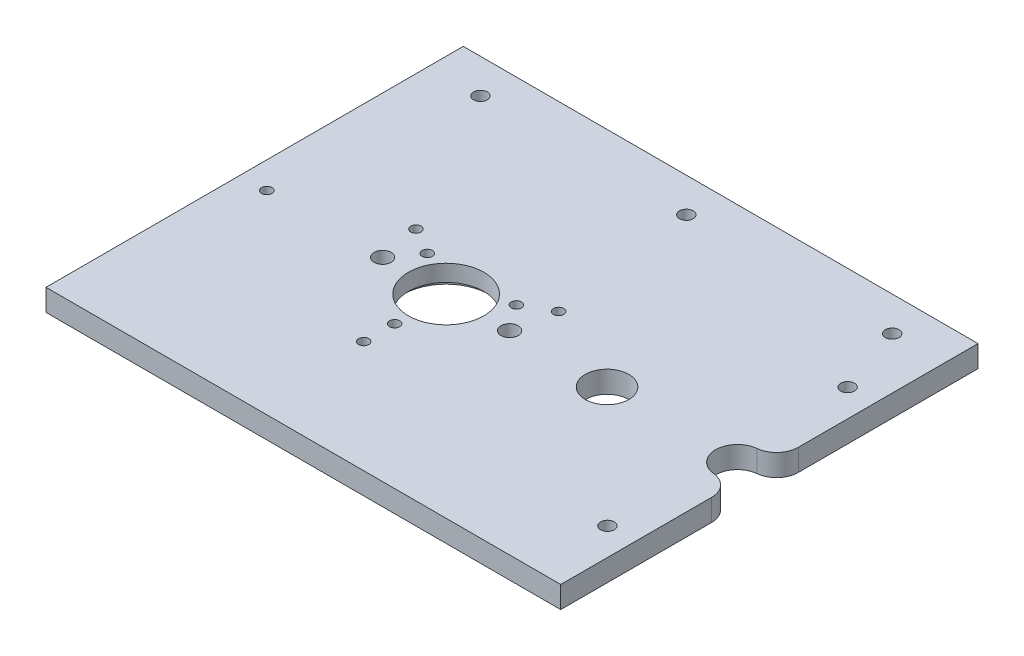
ISO-10303-21;
HEADER;
FILE_DESCRIPTION(('STEP AP214'),'2;1');
FILE_NAME('part.step','',(''),(''),'','','');
FILE_SCHEMA(('AUTOMOTIVE_DESIGN { 1 0 10303 214 1 1 1 1 }'));
ENDSEC;
DATA;
#1=APPLICATION_CONTEXT('core data for automotive mechanical design processes');
#2=APPLICATION_PROTOCOL_DEFINITION('international standard','automotive_design',2000,#1);
#3=PRODUCT_CONTEXT('',#1,'mechanical');
#4=PRODUCT('Part','Part','',(#3));
#5=PRODUCT_RELATED_PRODUCT_CATEGORY('part','',(#4));
#6=PRODUCT_DEFINITION_FORMATION('','',#4);
#7=PRODUCT_DEFINITION_CONTEXT('part definition',#1,'design');
#8=PRODUCT_DEFINITION('design','',#6,#7);
#9=PRODUCT_DEFINITION_SHAPE('','',#8);
#10=(LENGTH_UNIT() NAMED_UNIT(*) SI_UNIT(.MILLI.,.METRE.));
#11=(NAMED_UNIT(*) PLANE_ANGLE_UNIT() SI_UNIT($,.RADIAN.));
#12=(NAMED_UNIT(*) SI_UNIT($,.STERADIAN.) SOLID_ANGLE_UNIT());
#13=UNCERTAINTY_MEASURE_WITH_UNIT(LENGTH_MEASURE(1.E-05),#10,'distance_accuracy_value','');
#14=(GEOMETRIC_REPRESENTATION_CONTEXT(3) GLOBAL_UNCERTAINTY_ASSIGNED_CONTEXT((#13)) GLOBAL_UNIT_ASSIGNED_CONTEXT((#10,
#11,#12)) REPRESENTATION_CONTEXT('',''));
#15=CARTESIAN_POINT('',(0.,0.,0.));
#16=DIRECTION('',(0.,0.,1.));
#17=DIRECTION('',(1.,0.,0.));
#18=AXIS2_PLACEMENT_3D('',#15,#16,#17);
#19=CARTESIAN_POINT('',(75.,3.175,-50.8));
#20=DIRECTION('',(-1.,0.,0.));
#21=DIRECTION('',(0.,0.,1.));
#22=AXIS2_PLACEMENT_3D('',#19,#20,#21);
#23=PLANE('',#22);
#24=DIRECTION('',(0.,0.,-1.));
#25=VECTOR('',#24,1.);
#26=CARTESIAN_POINT('',(75.,-3.175,-50.8));
#27=LINE('',#26,#25);
#28=CARTESIAN_POINT('',(75.,-3.175,50.8));
#29=VERTEX_POINT('',#28);
#30=CARTESIAN_POINT('',(75.,-3.175,6.83833454217762));
#31=VERTEX_POINT('',#30);
#32=EDGE_CURVE('E119',#29,#31,#27,.T.);
#33=ORIENTED_EDGE('',*,*,#32,.T.);
#34=DIRECTION('',(0.,1.,0.));
#35=VECTOR('',#34,1.);
#36=CARTESIAN_POINT('',(75.,3.175,6.83833454217762));
#37=LINE('',#36,#35);
#38=CARTESIAN_POINT('',(75.,3.175,6.83833454217762));
#39=VERTEX_POINT('',#38);
#40=EDGE_CURVE('E255',#31,#39,#37,.T.);
#41=ORIENTED_EDGE('',*,*,#40,.T.);
#42=DIRECTION('',(0.,0.,-1.));
#43=VECTOR('',#42,1.);
#44=CARTESIAN_POINT('',(75.,3.175,-50.8));
#45=LINE('',#44,#43);
#46=CARTESIAN_POINT('',(75.,3.175,50.8));
#47=VERTEX_POINT('',#46);
#48=EDGE_CURVE('E235',#47,#39,#45,.T.);
#49=ORIENTED_EDGE('',*,*,#48,.F.);
#50=DIRECTION('',(0.,-1.,0.));
#51=VECTOR('',#50,1.);
#52=CARTESIAN_POINT('',(75.,3.175,50.8));
#53=LINE('',#52,#51);
#54=EDGE_CURVE('E242',#47,#29,#53,.T.);
#55=ORIENTED_EDGE('',*,*,#54,.T.);
#56=EDGE_LOOP('',(#33,#41,#49,#55));
#57=FACE_BOUND('',#56,.T.);
#58=ADVANCED_FACE('F41',(#57),#23,.F.);
#59=CARTESIAN_POINT('',(75.,3.175,-18.4383345421776));
#60=VERTEX_POINT('',#59);
#61=CARTESIAN_POINT('',(75.,3.17500000000001,-70.8));
#62=VERTEX_POINT('',#61);
#63=EDGE_CURVE('E239',#60,#62,#45,.T.);
#64=ORIENTED_EDGE('',*,*,#63,.F.);
#65=DIRECTION('',(0.,1.,0.));
#66=VECTOR('',#65,1.);
#67=CARTESIAN_POINT('',(75.,3.175,-18.4383345421776));
#68=LINE('',#67,#66);
#69=CARTESIAN_POINT('',(75.,-3.175,-18.4383345421776));
#70=VERTEX_POINT('',#69);
#71=EDGE_CURVE('E116',#60,#70,#68,.F.);
#72=ORIENTED_EDGE('',*,*,#71,.T.);
#73=CARTESIAN_POINT('',(75.,-3.175,-70.8));
#74=VERTEX_POINT('',#73);
#75=EDGE_CURVE('E110',#70,#74,#27,.T.);
#76=ORIENTED_EDGE('',*,*,#75,.T.);
#77=DIRECTION('',(0.,-1.,0.));
#78=VECTOR('',#77,1.);
#79=CARTESIAN_POINT('',(75.,154.502459504216,-70.8));
#80=LINE('',#79,#78);
#81=EDGE_CURVE('E114',#62,#74,#80,.T.);
#82=ORIENTED_EDGE('',*,*,#81,.F.);
#83=EDGE_LOOP('',(#64,#72,#76,#82));
#84=FACE_BOUND('',#83,.T.);
#85=ADVANCED_FACE('F113',(#84),#23,.F.);
#86=CARTESIAN_POINT('',(-75.,3.175,-50.8));
#87=DIRECTION('',(1.,0.,0.));
#88=DIRECTION('',(0.,0.,-1.));
#89=AXIS2_PLACEMENT_3D('',#86,#87,#88);
#90=PLANE('',#89);
#91=DIRECTION('',(0.,0.,1.));
#92=VECTOR('',#91,1.);
#93=CARTESIAN_POINT('',(-75.,-3.175,-50.8));
#94=LINE('',#93,#92);
#95=CARTESIAN_POINT('',(-75.,-3.175,-70.8));
#96=VERTEX_POINT('',#95);
#97=CARTESIAN_POINT('',(-75.,-3.175,50.8));
#98=VERTEX_POINT('',#97);
#99=EDGE_CURVE('E134',#96,#98,#94,.T.);
#100=ORIENTED_EDGE('',*,*,#99,.T.);
#101=DIRECTION('',(0.,-1.,0.));
#102=VECTOR('',#101,1.);
#103=CARTESIAN_POINT('',(-75.,3.175,50.8));
#104=LINE('',#103,#102);
#105=CARTESIAN_POINT('',(-75.,3.175,50.8));
#106=VERTEX_POINT('',#105);
#107=EDGE_CURVE('E250',#106,#98,#104,.T.);
#108=ORIENTED_EDGE('',*,*,#107,.F.);
#109=DIRECTION('',(0.,0.,1.));
#110=VECTOR('',#109,1.);
#111=CARTESIAN_POINT('',(-75.,3.175,-50.8));
#112=LINE('',#111,#110);
#113=CARTESIAN_POINT('',(-75.,3.17500000000001,-70.8));
#114=VERTEX_POINT('',#113);
#115=EDGE_CURVE('E238',#114,#106,#112,.T.);
#116=ORIENTED_EDGE('',*,*,#115,.F.);
#117=DIRECTION('',(0.,-1.,0.));
#118=VECTOR('',#117,1.);
#119=CARTESIAN_POINT('',(-75.,154.502459504216,-70.8));
#120=LINE('',#119,#118);
#121=EDGE_CURVE('E129',#114,#96,#120,.T.);
#122=ORIENTED_EDGE('',*,*,#121,.T.);
#123=EDGE_LOOP('',(#100,#108,#116,#122));
#124=FACE_BOUND('',#123,.T.);
#125=ADVANCED_FACE('F351',(#124),#90,.F.);
#126=CARTESIAN_POINT('',(-75.,3.175,50.8));
#127=DIRECTION('',(0.,0.,-1.));
#128=DIRECTION('',(-1.,0.,0.));
#129=AXIS2_PLACEMENT_3D('',#126,#127,#128);
#130=PLANE('',#129);
#131=DIRECTION('',(1.,0.,0.));
#132=VECTOR('',#131,1.);
#133=CARTESIAN_POINT('',(-75.,-3.175,50.8));
#134=LINE('',#133,#132);
#135=EDGE_CURVE('E246',#98,#29,#134,.T.);
#136=ORIENTED_EDGE('',*,*,#135,.T.);
#137=ORIENTED_EDGE('',*,*,#54,.F.);
#138=DIRECTION('',(1.,0.,0.));
#139=VECTOR('',#138,1.);
#140=CARTESIAN_POINT('',(-75.,3.175,50.8));
#141=LINE('',#140,#139);
#142=EDGE_CURVE('E241',#106,#47,#141,.T.);
#143=ORIENTED_EDGE('',*,*,#142,.F.);
#144=ORIENTED_EDGE('',*,*,#107,.T.);
#145=EDGE_LOOP('',(#136,#137,#143,#144));
#146=FACE_BOUND('',#145,.T.);
#147=ADVANCED_FACE('F297',(#146),#130,.F.);
#148=CARTESIAN_POINT('',(0.,3.175,0.));
#149=DIRECTION('',(0.,1.,0.));
#150=DIRECTION('',(0.,0.,1.));
#151=AXIS2_PLACEMENT_3D('',#148,#149,#150);
#152=PLANE('',#151);
#153=CARTESIAN_POINT('',(3.5,3.175,-5.79999999999999));
#154=DIRECTION('',(0.,-1.,0.));
#155=DIRECTION('',(0.,0.,-1.));
#156=AXIS2_PLACEMENT_3D('',#153,#154,#155);
#157=CIRCLE('',#156,2.5);
#158=CARTESIAN_POINT('',(3.5,3.175,-8.29999999999999));
#159=VERTEX_POINT('',#158);
#160=EDGE_CURVE('E159',#159,#159,#157,.T.);
#161=ORIENTED_EDGE('',*,*,#160,.T.);
#162=EDGE_LOOP('',(#161));
#163=FACE_BOUND('',#162,.T.);
#164=CARTESIAN_POINT('',(-33.5,3.175,-5.79999999999999));
#165=DIRECTION('',(0.,-1.,0.));
#166=DIRECTION('',(0.,0.,1.));
#167=AXIS2_PLACEMENT_3D('',#164,#165,#166);
#168=CIRCLE('',#167,2.5);
#169=CARTESIAN_POINT('',(-33.5,3.175,-3.3));
#170=VERTEX_POINT('',#169);
#171=EDGE_CURVE('E154',#170,#170,#168,.T.);
#172=ORIENTED_EDGE('',*,*,#171,.T.);
#173=EDGE_LOOP('',(#172));
#174=FACE_BOUND('',#173,.T.);
#175=CARTESIAN_POINT('',(5.78460969082654,3.175,-17.8));
#176=DIRECTION('',(0.,1.,0.));
#177=DIRECTION('',(0.,0.,1.));
#178=AXIS2_PLACEMENT_3D('',#175,#176,#177);
#179=CIRCLE('',#178,1.5);
#180=CARTESIAN_POINT('',(5.78460969082654,3.175,-16.3));
#181=VERTEX_POINT('',#180);
#182=EDGE_CURVE('E184',#181,#181,#179,.T.);
#183=ORIENTED_EDGE('',*,*,#182,.F.);
#184=EDGE_LOOP('',(#183));
#185=FACE_BOUND('',#184,.T.);
#186=CARTESIAN_POINT('',(-15.,3.175,18.2));
#187=DIRECTION('',(0.,1.,0.));
#188=DIRECTION('',(0.,0.,1.));
#189=AXIS2_PLACEMENT_3D('',#186,#187,#188);
#190=CIRCLE('',#189,1.5);
#191=CARTESIAN_POINT('',(-15.,3.175,19.7));
#192=VERTEX_POINT('',#191);
#193=EDGE_CURVE('E185',#192,#192,#190,.T.);
#194=ORIENTED_EDGE('',*,*,#193,.F.);
#195=EDGE_LOOP('',(#194));
#196=FACE_BOUND('',#195,.T.);
#197=CARTESIAN_POINT('',(-27.9903810567666,3.175,-13.3));
#198=DIRECTION('',(0.,1.,0.));
#199=DIRECTION('',(0.,0.,1.));
#200=AXIS2_PLACEMENT_3D('',#197,#198,#199);
#201=CIRCLE('',#200,1.5);
#202=CARTESIAN_POINT('',(-27.9903810567666,3.175,-11.8));
#203=VERTEX_POINT('',#202);
#204=EDGE_CURVE('E192',#203,#203,#201,.T.);
#205=ORIENTED_EDGE('',*,*,#204,.F.);
#206=EDGE_LOOP('',(#205));
#207=FACE_BOUND('',#206,.T.);
#208=CARTESIAN_POINT('',(-35.7846096908265,3.175,-17.8));
#209=DIRECTION('',(0.,1.,0.));
#210=DIRECTION('',(0.,0.,1.));
#211=AXIS2_PLACEMENT_3D('',#208,#209,#210);
#212=CIRCLE('',#211,1.5);
#213=CARTESIAN_POINT('',(-35.7846096908265,3.175,-16.3));
#214=VERTEX_POINT('',#213);
#215=EDGE_CURVE('E171',#214,#214,#212,.T.);
#216=ORIENTED_EDGE('',*,*,#215,.F.);
#217=EDGE_LOOP('',(#216));
#218=FACE_BOUND('',#217,.T.);
#219=CARTESIAN_POINT('',(-2.00961894323341,3.175,-13.3));
#220=DIRECTION('',(0.,1.,0.));
#221=DIRECTION('',(0.,0.,1.));
#222=AXIS2_PLACEMENT_3D('',#219,#220,#221);
#223=CIRCLE('',#222,1.5);
#224=CARTESIAN_POINT('',(-2.00961894323341,3.175,-11.8));
#225=VERTEX_POINT('',#224);
#226=EDGE_CURVE('E178',#225,#225,#223,.T.);
#227=ORIENTED_EDGE('',*,*,#226,.F.);
#228=EDGE_LOOP('',(#227));
#229=FACE_BOUND('',#228,.T.);
#230=CARTESIAN_POINT('',(-15.,3.175,9.20000000000001));
#231=DIRECTION('',(0.,1.,0.));
#232=DIRECTION('',(0.,0.,1.));
#233=AXIS2_PLACEMENT_3D('',#230,#231,#232);
#234=CIRCLE('',#233,1.5);
#235=CARTESIAN_POINT('',(-15.,3.175,10.7));
#236=VERTEX_POINT('',#235);
#237=EDGE_CURVE('E188',#236,#236,#234,.T.);
#238=ORIENTED_EDGE('',*,*,#237,.F.);
#239=EDGE_LOOP('',(#238));
#240=FACE_BOUND('',#239,.T.);
#241=CARTESIAN_POINT('',(67.,3.175,-40.8));
#242=DIRECTION('',(0.,1.,0.));
#243=DIRECTION('',(0.,0.,1.));
#244=AXIS2_PLACEMENT_3D('',#241,#242,#243);
#245=CIRCLE('',#244,2.);
#246=CARTESIAN_POINT('',(67.,3.175,-38.8));
#247=VERTEX_POINT('',#246);
#248=EDGE_CURVE('E210',#247,#247,#245,.T.);
#249=ORIENTED_EDGE('',*,*,#248,.F.);
#250=EDGE_LOOP('',(#249));
#251=FACE_BOUND('',#250,.T.);
#252=ORIENTED_EDGE('',*,*,#48,.T.);
#253=CARTESIAN_POINT('',(68.65,3.175,6.83833454217762));
#254=DIRECTION('',(0.,1.,0.));
#255=DIRECTION('',(0.,0.,1.));
#256=AXIS2_PLACEMENT_3D('',#253,#254,#255);
#257=CIRCLE('',#256,6.35);
#258=CARTESIAN_POINT('',(69.275,3.175,0.519167271088809));
#259=VERTEX_POINT('',#258);
#260=EDGE_CURVE('E260',#39,#259,#257,.T.);
#261=ORIENTED_EDGE('',*,*,#260,.T.);
#262=CARTESIAN_POINT('',(69.9,3.175,-5.8));
#263=DIRECTION('',(0.,1.,0.));
#264=DIRECTION('',(0.,0.,1.));
#265=AXIS2_PLACEMENT_3D('',#262,#263,#264);
#266=CIRCLE('',#265,6.35);
#267=CARTESIAN_POINT('',(69.275,3.175,-12.1191672710888));
#268=VERTEX_POINT('',#267);
#269=EDGE_CURVE('E205',#268,#259,#266,.T.);
#270=ORIENTED_EDGE('',*,*,#269,.F.);
#271=CARTESIAN_POINT('',(68.65,3.175,-18.4383345421776));
#272=DIRECTION('',(0.,1.,0.));
#273=DIRECTION('',(0.,0.,1.));
#274=AXIS2_PLACEMENT_3D('',#271,#272,#273);
#275=CIRCLE('',#274,6.35);
#276=EDGE_CURVE('E258',#268,#60,#275,.T.);
#277=ORIENTED_EDGE('',*,*,#276,.T.);
#278=ORIENTED_EDGE('',*,*,#63,.T.);
#279=DIRECTION('',(1.,0.,0.));
#280=VECTOR('',#279,1.);
#281=CARTESIAN_POINT('',(-75.,3.17500000000001,-70.8));
#282=LINE('',#281,#280);
#283=EDGE_CURVE('E128',#114,#62,#282,.T.);
#284=ORIENTED_EDGE('',*,*,#283,.F.);
#285=ORIENTED_EDGE('',*,*,#115,.T.);
#286=ORIENTED_EDGE('',*,*,#142,.T.);
#287=EDGE_LOOP('',(#252,#261,#270,#277,#278,#284,#285,#286));
#288=FACE_BOUND('',#287,.T.);
#289=CARTESIAN_POINT('',(67.,3.175,29.2));
#290=DIRECTION('',(0.,1.,0.));
#291=DIRECTION('',(0.,0.,-1.));
#292=AXIS2_PLACEMENT_3D('',#289,#290,#291);
#293=CIRCLE('',#292,2.);
#294=CARTESIAN_POINT('',(67.,3.175,27.2));
#295=VERTEX_POINT('',#294);
#296=EDGE_CURVE('E213',#295,#295,#293,.T.);
#297=ORIENTED_EDGE('',*,*,#296,.F.);
#298=EDGE_LOOP('',(#297));
#299=FACE_BOUND('',#298,.T.);
#300=CARTESIAN_POINT('',(-15.,3.175,-5.79999999999999));
#301=DIRECTION('',(0.,1.,0.));
#302=DIRECTION('',(0.,0.,1.));
#303=AXIS2_PLACEMENT_3D('',#300,#301,#302);
#304=CIRCLE('',#303,11.);
#305=CARTESIAN_POINT('',(-15.,3.175,5.20000000000001));
#306=VERTEX_POINT('',#305);
#307=EDGE_CURVE('E219',#306,#306,#304,.T.);
#308=ORIENTED_EDGE('',*,*,#307,.F.);
#309=EDGE_LOOP('',(#308));
#310=FACE_BOUND('',#309,.T.);
#311=CARTESIAN_POINT('',(-67.25,3.175,-5.8));
#312=DIRECTION('',(0.,1.,0.));
#313=DIRECTION('',(0.,0.,1.));
#314=AXIS2_PLACEMENT_3D('',#311,#312,#313);
#315=CIRCLE('',#314,1.5);
#316=CARTESIAN_POINT('',(-67.25,3.175,-4.3));
#317=VERTEX_POINT('',#316);
#318=EDGE_CURVE('E216',#317,#317,#315,.T.);
#319=ORIENTED_EDGE('',*,*,#318,.F.);
#320=EDGE_LOOP('',(#319));
#321=FACE_BOUND('',#320,.T.);
#322=CARTESIAN_POINT('',(31.9,3.175,-5.8));
#323=DIRECTION('',(0.,1.,0.));
#324=DIRECTION('',(0.,0.,1.));
#325=AXIS2_PLACEMENT_3D('',#322,#323,#324);
#326=CIRCLE('',#325,6.35);
#327=CARTESIAN_POINT('',(31.9,3.175,0.550000000000007));
#328=VERTEX_POINT('',#327);
#329=EDGE_CURVE('E223',#328,#328,#326,.T.);
#330=ORIENTED_EDGE('',*,*,#329,.F.);
#331=EDGE_LOOP('',(#330));
#332=FACE_BOUND('',#331,.T.);
#333=CARTESIAN_POINT('',(-60.,3.17500000000001,-60.8));
#334=DIRECTION('',(0.,1.,0.));
#335=DIRECTION('',(0.,0.,1.));
#336=AXIS2_PLACEMENT_3D('',#333,#334,#335);
#337=CIRCLE('',#336,2.);
#338=CARTESIAN_POINT('',(-60.,3.17500000000001,-58.8));
#339=VERTEX_POINT('',#338);
#340=EDGE_CURVE('E136',#339,#339,#337,.F.);
#341=ORIENTED_EDGE('',*,*,#340,.T.);
#342=EDGE_LOOP('',(#341));
#343=FACE_BOUND('',#342,.T.);
#344=CARTESIAN_POINT('',(60.,3.17500000000001,-60.8));
#345=DIRECTION('',(0.,1.,0.));
#346=DIRECTION('',(0.,0.,1.));
#347=AXIS2_PLACEMENT_3D('',#344,#345,#346);
#348=CIRCLE('',#347,2.);
#349=CARTESIAN_POINT('',(60.,3.17500000000001,-58.8));
#350=VERTEX_POINT('',#349);
#351=EDGE_CURVE('E140',#350,#350,#348,.F.);
#352=ORIENTED_EDGE('',*,*,#351,.T.);
#353=EDGE_LOOP('',(#352));
#354=FACE_BOUND('',#353,.T.);
#355=CARTESIAN_POINT('',(0.,3.17500000000001,-60.8));
#356=DIRECTION('',(0.,1.,0.));
#357=DIRECTION('',(0.,0.,1.));
#358=AXIS2_PLACEMENT_3D('',#355,#356,#357);
#359=CIRCLE('',#358,2.);
#360=CARTESIAN_POINT('',(0.,3.17500000000001,-58.8));
#361=VERTEX_POINT('',#360);
#362=EDGE_CURVE('E151',#361,#361,#359,.F.);
#363=ORIENTED_EDGE('',*,*,#362,.T.);
#364=EDGE_LOOP('',(#363));
#365=FACE_BOUND('',#364,.T.);
#366=ADVANCED_FACE('F294',(#163,#174,#185,#196,#207,#218,#229,#240,#251,#288,#299,#310,#321,
#332,#343,#354,#365),#152,.T.);
#367=CARTESIAN_POINT('',(0.,-3.175,0.));
#368=DIRECTION('',(0.,1.,0.));
#369=DIRECTION('',(0.,0.,1.));
#370=AXIS2_PLACEMENT_3D('',#367,#368,#369);
#371=PLANE('',#370);
#372=CARTESIAN_POINT('',(-33.5,-3.175,-5.79999999999999));
#373=DIRECTION('',(0.,1.,0.));
#374=DIRECTION('',(0.,0.,1.));
#375=AXIS2_PLACEMENT_3D('',#372,#373,#374);
#376=CIRCLE('',#375,5.);
#377=CARTESIAN_POINT('',(-33.5,-3.175,-0.799999999999988));
#378=VERTEX_POINT('',#377);
#379=EDGE_CURVE('E50',#378,#378,#376,.T.);
#380=ORIENTED_EDGE('',*,*,#379,.T.);
#381=EDGE_LOOP('',(#380));
#382=FACE_BOUND('',#381,.T.);
#383=CARTESIAN_POINT('',(3.5,-3.175,-5.79999999999999));
#384=DIRECTION('',(0.,1.,0.));
#385=DIRECTION('',(0.,0.,1.));
#386=AXIS2_PLACEMENT_3D('',#383,#384,#385);
#387=CIRCLE('',#386,5.00000000000003);
#388=CARTESIAN_POINT('',(3.5,-3.175,-10.8));
#389=VERTEX_POINT('',#388);
#390=EDGE_CURVE('E274',#389,#389,#387,.T.);
#391=ORIENTED_EDGE('',*,*,#390,.T.);
#392=EDGE_LOOP('',(#391));
#393=FACE_BOUND('',#392,.T.);
#394=CARTESIAN_POINT('',(-15.,-3.175,-5.79999999999999));
#395=DIRECTION('',(0.,1.,0.));
#396=DIRECTION('',(0.,0.,1.));
#397=AXIS2_PLACEMENT_3D('',#394,#395,#396);
#398=CIRCLE('',#397,12.5);
#399=CARTESIAN_POINT('',(-15.,-3.175,6.70000000000001));
#400=VERTEX_POINT('',#399);
#401=EDGE_CURVE('E162',#400,#400,#398,.T.);
#402=ORIENTED_EDGE('',*,*,#401,.T.);
#403=EDGE_LOOP('',(#402));
#404=FACE_BOUND('',#403,.T.);
#405=CARTESIAN_POINT('',(5.78460969082654,-3.175,-17.8));
#406=DIRECTION('',(0.,1.,0.));
#407=DIRECTION('',(0.,0.,1.));
#408=AXIS2_PLACEMENT_3D('',#405,#406,#407);
#409=CIRCLE('',#408,1.5);
#410=CARTESIAN_POINT('',(5.78460969082654,-3.175,-16.3));
#411=VERTEX_POINT('',#410);
#412=EDGE_CURVE('E199',#411,#411,#409,.T.);
#413=ORIENTED_EDGE('',*,*,#412,.T.);
#414=EDGE_LOOP('',(#413));
#415=FACE_BOUND('',#414,.T.);
#416=CARTESIAN_POINT('',(-15.,-3.175,18.2));
#417=DIRECTION('',(0.,1.,0.));
#418=DIRECTION('',(0.,0.,1.));
#419=AXIS2_PLACEMENT_3D('',#416,#417,#418);
#420=CIRCLE('',#419,1.5);
#421=CARTESIAN_POINT('',(-15.,-3.175,19.7));
#422=VERTEX_POINT('',#421);
#423=EDGE_CURVE('E189',#422,#422,#420,.T.);
#424=ORIENTED_EDGE('',*,*,#423,.T.);
#425=EDGE_LOOP('',(#424));
#426=FACE_BOUND('',#425,.T.);
#427=CARTESIAN_POINT('',(-27.9903810567666,-3.175,-13.3));
#428=DIRECTION('',(0.,1.,0.));
#429=DIRECTION('',(0.,0.,1.));
#430=AXIS2_PLACEMENT_3D('',#427,#428,#429);
#431=CIRCLE('',#430,1.5);
#432=CARTESIAN_POINT('',(-27.9903810567666,-3.175,-11.8));
#433=VERTEX_POINT('',#432);
#434=EDGE_CURVE('E174',#433,#433,#431,.T.);
#435=ORIENTED_EDGE('',*,*,#434,.T.);
#436=EDGE_LOOP('',(#435));
#437=FACE_BOUND('',#436,.T.);
#438=CARTESIAN_POINT('',(-35.7846096908265,-3.175,-17.8));
#439=DIRECTION('',(0.,1.,0.));
#440=DIRECTION('',(0.,0.,1.));
#441=AXIS2_PLACEMENT_3D('',#438,#439,#440);
#442=CIRCLE('',#441,1.5);
#443=CARTESIAN_POINT('',(-35.7846096908265,-3.175,-16.3));
#444=VERTEX_POINT('',#443);
#445=EDGE_CURVE('E175',#444,#444,#442,.T.);
#446=ORIENTED_EDGE('',*,*,#445,.T.);
#447=EDGE_LOOP('',(#446));
#448=FACE_BOUND('',#447,.T.);
#449=CARTESIAN_POINT('',(-2.00961894323341,-3.175,-13.3));
#450=DIRECTION('',(0.,1.,0.));
#451=DIRECTION('',(0.,0.,1.));
#452=AXIS2_PLACEMENT_3D('',#449,#450,#451);
#453=CIRCLE('',#452,1.5);
#454=CARTESIAN_POINT('',(-2.00961894323341,-3.175,-11.8));
#455=VERTEX_POINT('',#454);
#456=EDGE_CURVE('E181',#455,#455,#453,.T.);
#457=ORIENTED_EDGE('',*,*,#456,.T.);
#458=EDGE_LOOP('',(#457));
#459=FACE_BOUND('',#458,.T.);
#460=CARTESIAN_POINT('',(-15.,-3.175,9.20000000000001));
#461=DIRECTION('',(0.,1.,0.));
#462=DIRECTION('',(0.,0.,1.));
#463=AXIS2_PLACEMENT_3D('',#460,#461,#462);
#464=CIRCLE('',#463,1.5);
#465=CARTESIAN_POINT('',(-15.,-3.175,10.7));
#466=VERTEX_POINT('',#465);
#467=EDGE_CURVE('E202',#466,#466,#464,.T.);
#468=ORIENTED_EDGE('',*,*,#467,.T.);
#469=EDGE_LOOP('',(#468));
#470=FACE_BOUND('',#469,.T.);
#471=CARTESIAN_POINT('',(67.,-3.175,-40.8));
#472=DIRECTION('',(0.,1.,0.));
#473=DIRECTION('',(0.,0.,1.));
#474=AXIS2_PLACEMENT_3D('',#471,#472,#473);
#475=CIRCLE('',#474,2.);
#476=CARTESIAN_POINT('',(67.,-3.175,-38.8));
#477=VERTEX_POINT('',#476);
#478=EDGE_CURVE('E120',#477,#477,#475,.T.);
#479=ORIENTED_EDGE('',*,*,#478,.T.);
#480=EDGE_LOOP('',(#479));
#481=FACE_BOUND('',#480,.T.);
#482=CARTESIAN_POINT('',(67.,-3.175,29.2));
#483=DIRECTION('',(0.,1.,0.));
#484=DIRECTION('',(0.,0.,-1.));
#485=AXIS2_PLACEMENT_3D('',#482,#483,#484);
#486=CIRCLE('',#485,2.);
#487=CARTESIAN_POINT('',(67.,-3.175,27.2));
#488=VERTEX_POINT('',#487);
#489=EDGE_CURVE('E230',#488,#488,#486,.T.);
#490=ORIENTED_EDGE('',*,*,#489,.T.);
#491=EDGE_LOOP('',(#490));
#492=FACE_BOUND('',#491,.T.);
#493=CARTESIAN_POINT('',(-67.25,-3.175,-5.8));
#494=DIRECTION('',(0.,1.,0.));
#495=DIRECTION('',(0.,0.,1.));
#496=AXIS2_PLACEMENT_3D('',#493,#494,#495);
#497=CIRCLE('',#496,1.5);
#498=CARTESIAN_POINT('',(-67.25,-3.175,-4.3));
#499=VERTEX_POINT('',#498);
#500=EDGE_CURVE('E220',#499,#499,#497,.T.);
#501=ORIENTED_EDGE('',*,*,#500,.T.);
#502=EDGE_LOOP('',(#501));
#503=FACE_BOUND('',#502,.T.);
#504=CARTESIAN_POINT('',(31.9,-3.175,-5.8));
#505=DIRECTION('',(0.,1.,0.));
#506=DIRECTION('',(0.,0.,1.));
#507=AXIS2_PLACEMENT_3D('',#504,#505,#506);
#508=CIRCLE('',#507,6.35);
#509=CARTESIAN_POINT('',(31.9,-3.175,0.550000000000007));
#510=VERTEX_POINT('',#509);
#511=EDGE_CURVE('E215',#510,#510,#508,.T.);
#512=ORIENTED_EDGE('',*,*,#511,.T.);
#513=EDGE_LOOP('',(#512));
#514=FACE_BOUND('',#513,.T.);
#515=CARTESIAN_POINT('',(69.9,-3.175,-5.8));
#516=DIRECTION('',(0.,1.,0.));
#517=DIRECTION('',(0.,0.,1.));
#518=AXIS2_PLACEMENT_3D('',#515,#516,#517);
#519=CIRCLE('',#518,6.35);
#520=CARTESIAN_POINT('',(69.275,-3.175,-12.1191672710888));
#521=VERTEX_POINT('',#520);
#522=CARTESIAN_POINT('',(69.275,-3.175,0.519167271088809));
#523=VERTEX_POINT('',#522);
#524=EDGE_CURVE('E253',#521,#523,#519,.T.);
#525=ORIENTED_EDGE('',*,*,#524,.T.);
#526=CARTESIAN_POINT('',(68.65,-3.175,6.83833454217762));
#527=DIRECTION('',(0.,1.,0.));
#528=DIRECTION('',(0.,0.,1.));
#529=AXIS2_PLACEMENT_3D('',#526,#527,#528);
#530=CIRCLE('',#529,6.35);
#531=EDGE_CURVE('E266',#523,#31,#530,.F.);
#532=ORIENTED_EDGE('',*,*,#531,.T.);
#533=ORIENTED_EDGE('',*,*,#32,.F.);
#534=ORIENTED_EDGE('',*,*,#135,.F.);
#535=ORIENTED_EDGE('',*,*,#99,.F.);
#536=DIRECTION('',(1.,0.,0.));
#537=VECTOR('',#536,1.);
#538=CARTESIAN_POINT('',(-75.,-3.175,-70.8));
#539=LINE('',#538,#537);
#540=EDGE_CURVE('E126',#96,#74,#539,.T.);
#541=ORIENTED_EDGE('',*,*,#540,.T.);
#542=ORIENTED_EDGE('',*,*,#75,.F.);
#543=CARTESIAN_POINT('',(68.65,-3.175,-18.4383345421776));
#544=DIRECTION('',(0.,1.,0.));
#545=DIRECTION('',(0.,0.,1.));
#546=AXIS2_PLACEMENT_3D('',#543,#544,#545);
#547=CIRCLE('',#546,6.35);
#548=EDGE_CURVE('E57',#70,#521,#547,.F.);
#549=ORIENTED_EDGE('',*,*,#548,.T.);
#550=EDGE_LOOP('',(#525,#532,#533,#534,#535,#541,#542,#549));
#551=FACE_BOUND('',#550,.T.);
#552=CARTESIAN_POINT('',(60.,-3.175,-60.8));
#553=DIRECTION('',(0.,-1.,0.));
#554=DIRECTION('',(0.,0.,-1.));
#555=AXIS2_PLACEMENT_3D('',#552,#553,#554);
#556=CIRCLE('',#555,2.);
#557=CARTESIAN_POINT('',(60.,-3.175,-62.8));
#558=VERTEX_POINT('',#557);
#559=EDGE_CURVE('E137',#558,#558,#556,.T.);
#560=ORIENTED_EDGE('',*,*,#559,.F.);
#561=EDGE_LOOP('',(#560));
#562=FACE_BOUND('',#561,.T.);
#563=CARTESIAN_POINT('',(-60.,-3.175,-60.8));
#564=DIRECTION('',(0.,-1.,0.));
#565=DIRECTION('',(0.,0.,-1.));
#566=AXIS2_PLACEMENT_3D('',#563,#564,#565);
#567=CIRCLE('',#566,2.);
#568=CARTESIAN_POINT('',(-60.,-3.175,-62.8));
#569=VERTEX_POINT('',#568);
#570=EDGE_CURVE('E143',#569,#569,#567,.T.);
#571=ORIENTED_EDGE('',*,*,#570,.F.);
#572=EDGE_LOOP('',(#571));
#573=FACE_BOUND('',#572,.T.);
#574=CARTESIAN_POINT('',(0.,-3.175,-60.8));
#575=DIRECTION('',(0.,-1.,0.));
#576=DIRECTION('',(0.,0.,-1.));
#577=AXIS2_PLACEMENT_3D('',#574,#575,#576);
#578=CIRCLE('',#577,2.);
#579=CARTESIAN_POINT('',(0.,-3.175,-62.8));
#580=VERTEX_POINT('',#579);
#581=EDGE_CURVE('E146',#580,#580,#578,.T.);
#582=ORIENTED_EDGE('',*,*,#581,.F.);
#583=EDGE_LOOP('',(#582));
#584=FACE_BOUND('',#583,.T.);
#585=ADVANCED_FACE('F131',(#382,#393,#404,#415,#426,#437,#448,#459,#470,#481,#492,#503,#514,
#551,#562,#573,#584),#371,.F.);
#586=CARTESIAN_POINT('',(31.9,-3.175,-5.8));
#587=DIRECTION('',(0.,1.,0.));
#588=DIRECTION('',(0.,0.,1.));
#589=AXIS2_PLACEMENT_3D('',#586,#587,#588);
#590=CYLINDRICAL_SURFACE('',#589,6.35);
#591=ORIENTED_EDGE('',*,*,#511,.F.);
#592=EDGE_LOOP('',(#591));
#593=FACE_BOUND('',#592,.T.);
#594=ORIENTED_EDGE('',*,*,#329,.T.);
#595=EDGE_LOOP('',(#594));
#596=FACE_BOUND('',#595,.T.);
#597=ADVANCED_FACE('F394',(#593,#596),#590,.F.);
#598=CARTESIAN_POINT('',(-67.25,-3.175,-5.8));
#599=DIRECTION('',(0.,1.,0.));
#600=DIRECTION('',(0.,0.,1.));
#601=AXIS2_PLACEMENT_3D('',#598,#599,#600);
#602=CYLINDRICAL_SURFACE('',#601,1.5);
#603=ORIENTED_EDGE('',*,*,#500,.F.);
#604=EDGE_LOOP('',(#603));
#605=FACE_BOUND('',#604,.T.);
#606=ORIENTED_EDGE('',*,*,#318,.T.);
#607=EDGE_LOOP('',(#606));
#608=FACE_BOUND('',#607,.T.);
#609=ADVANCED_FACE('F400',(#605,#608),#602,.F.);
#610=CARTESIAN_POINT('',(-15.,-3.175,-5.79999999999999));
#611=DIRECTION('',(0.,1.,0.));
#612=DIRECTION('',(0.,0.,1.));
#613=AXIS2_PLACEMENT_3D('',#610,#611,#612);
#614=CYLINDRICAL_SURFACE('',#613,11.);
#615=CARTESIAN_POINT('',(-15.,-1.675,-5.79999999999999));
#616=DIRECTION('',(0.,1.,0.));
#617=DIRECTION('',(0.,0.,1.));
#618=AXIS2_PLACEMENT_3D('',#615,#616,#617);
#619=CIRCLE('',#618,11.);
#620=CARTESIAN_POINT('',(-15.,-1.675,5.20000000000001));
#621=VERTEX_POINT('',#620);
#622=EDGE_CURVE('E168',#621,#621,#619,.F.);
#623=ORIENTED_EDGE('',*,*,#622,.T.);
#624=EDGE_LOOP('',(#623));
#625=FACE_BOUND('',#624,.T.);
#626=ORIENTED_EDGE('',*,*,#307,.T.);
#627=EDGE_LOOP('',(#626));
#628=FACE_BOUND('',#627,.T.);
#629=ADVANCED_FACE('F396',(#625,#628),#614,.F.);
#630=CARTESIAN_POINT('',(67.,-3.175,29.2));
#631=DIRECTION('',(0.,1.,0.));
#632=DIRECTION('',(0.,0.,1.));
#633=AXIS2_PLACEMENT_3D('',#630,#631,#632);
#634=CYLINDRICAL_SURFACE('',#633,2.);
#635=ORIENTED_EDGE('',*,*,#489,.F.);
#636=EDGE_LOOP('',(#635));
#637=FACE_BOUND('',#636,.T.);
#638=ORIENTED_EDGE('',*,*,#296,.T.);
#639=EDGE_LOOP('',(#638));
#640=FACE_BOUND('',#639,.T.);
#641=ADVANCED_FACE('F399',(#637,#640),#634,.F.);
#642=CARTESIAN_POINT('',(69.9,-3.175,-5.8));
#643=DIRECTION('',(0.,1.,0.));
#644=DIRECTION('',(0.,0.,1.));
#645=AXIS2_PLACEMENT_3D('',#642,#643,#644);
#646=CYLINDRICAL_SURFACE('',#645,6.35);
#647=ORIENTED_EDGE('',*,*,#269,.T.);
#648=DIRECTION('',(0.,1.,0.));
#649=VECTOR('',#648,1.);
#650=CARTESIAN_POINT('',(69.275,-3.175,0.519167271088809));
#651=LINE('',#650,#649);
#652=EDGE_CURVE('E65',#259,#523,#651,.F.);
#653=ORIENTED_EDGE('',*,*,#652,.T.);
#654=ORIENTED_EDGE('',*,*,#524,.F.);
#655=DIRECTION('',(0.,1.,0.));
#656=VECTOR('',#655,1.);
#657=CARTESIAN_POINT('',(69.275,-3.175,-12.1191672710888));
#658=LINE('',#657,#656);
#659=EDGE_CURVE('E262',#521,#268,#658,.T.);
#660=ORIENTED_EDGE('',*,*,#659,.T.);
#661=EDGE_LOOP('',(#647,#653,#654,#660));
#662=FACE_BOUND('',#661,.T.);
#663=ADVANCED_FACE('F376',(#662),#646,.F.);
#664=CARTESIAN_POINT('',(67.,-3.175,-40.8));
#665=DIRECTION('',(0.,1.,0.));
#666=DIRECTION('',(0.,0.,1.));
#667=AXIS2_PLACEMENT_3D('',#664,#665,#666);
#668=CYLINDRICAL_SURFACE('',#667,2.);
#669=ORIENTED_EDGE('',*,*,#478,.F.);
#670=EDGE_LOOP('',(#669));
#671=FACE_BOUND('',#670,.T.);
#672=ORIENTED_EDGE('',*,*,#248,.T.);
#673=EDGE_LOOP('',(#672));
#674=FACE_BOUND('',#673,.T.);
#675=ADVANCED_FACE('F359',(#671,#674),#668,.F.);
#676=CARTESIAN_POINT('',(68.65,-3.175,6.83833454217762));
#677=DIRECTION('',(0.,1.,0.));
#678=DIRECTION('',(0.,0.,1.));
#679=AXIS2_PLACEMENT_3D('',#676,#677,#678);
#680=CYLINDRICAL_SURFACE('',#679,6.35);
#681=ORIENTED_EDGE('',*,*,#531,.F.);
#682=ORIENTED_EDGE('',*,*,#652,.F.);
#683=ORIENTED_EDGE('',*,*,#260,.F.);
#684=ORIENTED_EDGE('',*,*,#40,.F.);
#685=EDGE_LOOP('',(#681,#682,#683,#684));
#686=FACE_BOUND('',#685,.T.);
#687=ADVANCED_FACE('F355',(#686),#680,.T.);
#688=CARTESIAN_POINT('',(68.65,-3.175,-18.4383345421776));
#689=DIRECTION('',(0.,1.,0.));
#690=DIRECTION('',(0.,0.,1.));
#691=AXIS2_PLACEMENT_3D('',#688,#689,#690);
#692=CYLINDRICAL_SURFACE('',#691,6.35);
#693=ORIENTED_EDGE('',*,*,#276,.F.);
#694=ORIENTED_EDGE('',*,*,#659,.F.);
#695=ORIENTED_EDGE('',*,*,#548,.F.);
#696=ORIENTED_EDGE('',*,*,#71,.F.);
#697=EDGE_LOOP('',(#693,#694,#695,#696));
#698=FACE_BOUND('',#697,.T.);
#699=ADVANCED_FACE('F358',(#698),#692,.T.);
#700=CARTESIAN_POINT('',(-15.,-3.175,9.20000000000001));
#701=DIRECTION('',(0.,1.,0.));
#702=DIRECTION('',(0.,0.,1.));
#703=AXIS2_PLACEMENT_3D('',#700,#701,#702);
#704=CYLINDRICAL_SURFACE('',#703,1.5);
#705=ORIENTED_EDGE('',*,*,#467,.F.);
#706=EDGE_LOOP('',(#705));
#707=FACE_BOUND('',#706,.T.);
#708=ORIENTED_EDGE('',*,*,#237,.T.);
#709=EDGE_LOOP('',(#708));
#710=FACE_BOUND('',#709,.T.);
#711=ADVANCED_FACE('F362',(#707,#710),#704,.F.);
#712=CARTESIAN_POINT('',(-2.00961894323341,-3.175,-13.3));
#713=DIRECTION('',(0.,1.,0.));
#714=DIRECTION('',(0.,0.,1.));
#715=AXIS2_PLACEMENT_3D('',#712,#713,#714);
#716=CYLINDRICAL_SURFACE('',#715,1.5);
#717=ORIENTED_EDGE('',*,*,#456,.F.);
#718=EDGE_LOOP('',(#717));
#719=FACE_BOUND('',#718,.T.);
#720=ORIENTED_EDGE('',*,*,#226,.T.);
#721=EDGE_LOOP('',(#720));
#722=FACE_BOUND('',#721,.T.);
#723=ADVANCED_FACE('F371',(#719,#722),#716,.F.);
#724=CARTESIAN_POINT('',(-35.7846096908265,-3.175,-17.8));
#725=DIRECTION('',(0.,1.,0.));
#726=DIRECTION('',(0.,0.,1.));
#727=AXIS2_PLACEMENT_3D('',#724,#725,#726);
#728=CYLINDRICAL_SURFACE('',#727,1.5);
#729=ORIENTED_EDGE('',*,*,#445,.F.);
#730=EDGE_LOOP('',(#729));
#731=FACE_BOUND('',#730,.T.);
#732=ORIENTED_EDGE('',*,*,#215,.T.);
#733=EDGE_LOOP('',(#732));
#734=FACE_BOUND('',#733,.T.);
#735=ADVANCED_FACE('F422',(#731,#734),#728,.F.);
#736=CARTESIAN_POINT('',(-27.9903810567666,-3.175,-13.3));
#737=DIRECTION('',(0.,1.,0.));
#738=DIRECTION('',(0.,0.,1.));
#739=AXIS2_PLACEMENT_3D('',#736,#737,#738);
#740=CYLINDRICAL_SURFACE('',#739,1.5);
#741=ORIENTED_EDGE('',*,*,#434,.F.);
#742=EDGE_LOOP('',(#741));
#743=FACE_BOUND('',#742,.T.);
#744=ORIENTED_EDGE('',*,*,#204,.T.);
#745=EDGE_LOOP('',(#744));
#746=FACE_BOUND('',#745,.T.);
#747=ADVANCED_FACE('F419',(#743,#746),#740,.F.);
#748=CARTESIAN_POINT('',(-15.,-3.175,18.2));
#749=DIRECTION('',(0.,1.,0.));
#750=DIRECTION('',(0.,0.,1.));
#751=AXIS2_PLACEMENT_3D('',#748,#749,#750);
#752=CYLINDRICAL_SURFACE('',#751,1.5);
#753=ORIENTED_EDGE('',*,*,#423,.F.);
#754=EDGE_LOOP('',(#753));
#755=FACE_BOUND('',#754,.T.);
#756=ORIENTED_EDGE('',*,*,#193,.T.);
#757=EDGE_LOOP('',(#756));
#758=FACE_BOUND('',#757,.T.);
#759=ADVANCED_FACE('F417',(#755,#758),#752,.F.);
#760=CARTESIAN_POINT('',(5.78460969082654,-3.175,-17.8));
#761=DIRECTION('',(0.,1.,0.));
#762=DIRECTION('',(0.,0.,1.));
#763=AXIS2_PLACEMENT_3D('',#760,#761,#762);
#764=CYLINDRICAL_SURFACE('',#763,1.5);
#765=ORIENTED_EDGE('',*,*,#412,.F.);
#766=EDGE_LOOP('',(#765));
#767=FACE_BOUND('',#766,.T.);
#768=ORIENTED_EDGE('',*,*,#182,.T.);
#769=EDGE_LOOP('',(#768));
#770=FACE_BOUND('',#769,.T.);
#771=ADVANCED_FACE('F413',(#767,#770),#764,.F.);
#772=CARTESIAN_POINT('',(-15.,-1.675,-5.79999999999999));
#773=DIRECTION('',(0.,1.,0.));
#774=DIRECTION('',(0.,0.,1.));
#775=AXIS2_PLACEMENT_3D('',#772,#773,#774);
#776=PLANE('',#775);
#777=CARTESIAN_POINT('',(-15.,-1.675,-5.79999999999999));
#778=DIRECTION('',(0.,1.,0.));
#779=DIRECTION('',(0.,0.,1.));
#780=AXIS2_PLACEMENT_3D('',#777,#778,#779);
#781=CIRCLE('',#780,12.5);
#782=CARTESIAN_POINT('',(-15.,-1.675,6.70000000000001));
#783=VERTEX_POINT('',#782);
#784=EDGE_CURVE('E165',#783,#783,#781,.T.);
#785=ORIENTED_EDGE('',*,*,#784,.F.);
#786=EDGE_LOOP('',(#785));
#787=FACE_BOUND('',#786,.T.);
#788=ORIENTED_EDGE('',*,*,#622,.F.);
#789=EDGE_LOOP('',(#788));
#790=FACE_BOUND('',#789,.T.);
#791=ADVANCED_FACE('F416',(#787,#790),#776,.F.);
#792=CARTESIAN_POINT('',(-15.,-1.675,-5.79999999999999));
#793=DIRECTION('',(0.,-1.,0.));
#794=DIRECTION('',(0.,0.,-1.));
#795=AXIS2_PLACEMENT_3D('',#792,#793,#794);
#796=CYLINDRICAL_SURFACE('',#795,12.5);
#797=ORIENTED_EDGE('',*,*,#784,.T.);
#798=EDGE_LOOP('',(#797));
#799=FACE_BOUND('',#798,.T.);
#800=ORIENTED_EDGE('',*,*,#401,.F.);
#801=EDGE_LOOP('',(#800));
#802=FACE_BOUND('',#801,.T.);
#803=ADVANCED_FACE('F290',(#799,#802),#796,.F.);
#804=CARTESIAN_POINT('',(-33.5,3.175,-5.79999999999999));
#805=DIRECTION('',(0.,-1.,0.));
#806=DIRECTION('',(0.,0.,-1.));
#807=AXIS2_PLACEMENT_3D('',#804,#805,#806);
#808=CYLINDRICAL_SURFACE('',#807,2.5);
#809=CARTESIAN_POINT('',(-33.5,-0.67500000000001,-5.79999999999999));
#810=DIRECTION('',(0.,1.,0.));
#811=DIRECTION('',(0.,0.,1.));
#812=AXIS2_PLACEMENT_3D('',#809,#810,#811);
#813=CIRCLE('',#812,2.5);
#814=CARTESIAN_POINT('',(-33.5,-0.67500000000001,-3.3));
#815=VERTEX_POINT('',#814);
#816=EDGE_CURVE('E269',#815,#815,#813,.F.);
#817=ORIENTED_EDGE('',*,*,#816,.T.);
#818=EDGE_LOOP('',(#817));
#819=FACE_BOUND('',#818,.T.);
#820=ORIENTED_EDGE('',*,*,#171,.F.);
#821=EDGE_LOOP('',(#820));
#822=FACE_BOUND('',#821,.T.);
#823=ADVANCED_FACE('F287',(#819,#822),#808,.F.);
#824=CARTESIAN_POINT('',(3.5,3.175,-5.79999999999999));
#825=DIRECTION('',(0.,-1.,0.));
#826=DIRECTION('',(0.,0.,-1.));
#827=AXIS2_PLACEMENT_3D('',#824,#825,#826);
#828=CYLINDRICAL_SURFACE('',#827,2.5);
#829=CARTESIAN_POINT('',(3.5,-0.674999999999987,-5.79999999999999));
#830=DIRECTION('',(0.,1.,0.));
#831=DIRECTION('',(0.,0.,1.));
#832=AXIS2_PLACEMENT_3D('',#829,#830,#831);
#833=CIRCLE('',#832,2.5);
#834=CARTESIAN_POINT('',(3.5,-0.674999999999987,-8.29999999999999));
#835=VERTEX_POINT('',#834);
#836=EDGE_CURVE('E11',#835,#835,#833,.F.);
#837=ORIENTED_EDGE('',*,*,#836,.T.);
#838=EDGE_LOOP('',(#837));
#839=FACE_BOUND('',#838,.T.);
#840=ORIENTED_EDGE('',*,*,#160,.F.);
#841=EDGE_LOOP('',(#840));
#842=FACE_BOUND('',#841,.T.);
#843=ADVANCED_FACE('F284',(#839,#842),#828,.F.);
#844=CARTESIAN_POINT('',(-33.5,-0.67500000000001,-5.79999999999999));
#845=DIRECTION('',(0.,-1.,0.));
#846=DIRECTION('',(0.,0.,-1.));
#847=AXIS2_PLACEMENT_3D('',#844,#845,#846);
#848=CONICAL_SURFACE('',#847,2.5,0.785398163397452);
#849=ORIENTED_EDGE('',*,*,#379,.F.);
#850=EDGE_LOOP('',(#849));
#851=FACE_BOUND('',#850,.T.);
#852=ORIENTED_EDGE('',*,*,#816,.F.);
#853=EDGE_LOOP('',(#852));
#854=FACE_BOUND('',#853,.T.);
#855=ADVANCED_FACE('F281',(#851,#854),#848,.F.);
#856=CARTESIAN_POINT('',(3.5,-0.674999999999987,-5.79999999999999));
#857=DIRECTION('',(0.,-1.,0.));
#858=DIRECTION('',(0.,0.,-1.));
#859=AXIS2_PLACEMENT_3D('',#856,#857,#858);
#860=CONICAL_SURFACE('',#859,2.5,0.785398163397452);
#861=CARTESIAN_POINT('',(3.5,-3.175,-10.8));
#862=CARTESIAN_POINT('',(3.5,-3.14895833333333,-10.7739583333334));
#863=CARTESIAN_POINT('',(3.5,-3.12291666666667,-10.7479166666667));
#864=CARTESIAN_POINT('',(3.5,-3.07083333333333,-10.6958333333334));
#865=CARTESIAN_POINT('',(3.5,-3.04479166666667,-10.6697916666667));
#866=CARTESIAN_POINT('',(3.5,-2.99270833333333,-10.6177083333334));
#867=CARTESIAN_POINT('',(3.5,-2.96666666666667,-10.5916666666667));
#868=CARTESIAN_POINT('',(3.5,-2.91458333333333,-10.5395833333334));
#869=CARTESIAN_POINT('',(3.5,-2.88854166666667,-10.5135416666667));
#870=CARTESIAN_POINT('',(3.5,-2.83645833333333,-10.4614583333334));
#871=CARTESIAN_POINT('',(3.5,-2.81041666666667,-10.4354166666667));
#872=CARTESIAN_POINT('',(3.5,-2.75833333333333,-10.3833333333334));
#873=CARTESIAN_POINT('',(3.5,-2.73229166666666,-10.3572916666667));
#874=CARTESIAN_POINT('',(3.5,-2.68020833333333,-10.3052083333334));
#875=CARTESIAN_POINT('',(3.5,-2.65416666666666,-10.2791666666667));
#876=CARTESIAN_POINT('',(3.5,-2.60208333333333,-10.2270833333334));
#877=CARTESIAN_POINT('',(3.5,-2.57604166666666,-10.2010416666667));
#878=CARTESIAN_POINT('',(3.5,-2.52395833333333,-10.1489583333334));
#879=CARTESIAN_POINT('',(3.5,-2.49791666666666,-10.1229166666667));
#880=CARTESIAN_POINT('',(3.5,-2.44583333333333,-10.0708333333334));
#881=CARTESIAN_POINT('',(3.5,-2.41979166666666,-10.0447916666667));
#882=CARTESIAN_POINT('',(3.5,-2.36770833333333,-9.99270833333335));
#883=CARTESIAN_POINT('',(3.5,-2.34166666666666,-9.96666666666668));
#884=CARTESIAN_POINT('',(3.5,-2.28958333333333,-9.91458333333335));
#885=CARTESIAN_POINT('',(3.5,-2.26354166666666,-9.88854166666668));
#886=CARTESIAN_POINT('',(3.5,-2.21145833333333,-9.83645833333335));
#887=CARTESIAN_POINT('',(3.5,-2.18541666666666,-9.81041666666668));
#888=CARTESIAN_POINT('',(3.5,-2.13333333333333,-9.75833333333335));
#889=CARTESIAN_POINT('',(3.5,-2.10729166666666,-9.73229166666668));
#890=CARTESIAN_POINT('',(3.5,-2.05520833333333,-9.68020833333335));
#891=CARTESIAN_POINT('',(3.5,-2.02916666666666,-9.65416666666668));
#892=CARTESIAN_POINT('',(3.5,-1.97708333333333,-9.60208333333334));
#893=CARTESIAN_POINT('',(3.5,-1.95104166666666,-9.57604166666668));
#894=CARTESIAN_POINT('',(3.5,-1.89895833333333,-9.52395833333334));
#895=CARTESIAN_POINT('',(3.5,-1.87291666666666,-9.49791666666668));
#896=CARTESIAN_POINT('',(3.5,-1.82083333333333,-9.44583333333334));
#897=CARTESIAN_POINT('',(3.5,-1.79479166666666,-9.41979166666668));
#898=CARTESIAN_POINT('',(3.5,-1.74270833333333,-9.36770833333334));
#899=CARTESIAN_POINT('',(3.5,-1.71666666666666,-9.34166666666667));
#900=CARTESIAN_POINT('',(3.5,-1.66458333333333,-9.28958333333334));
#901=CARTESIAN_POINT('',(3.5,-1.63854166666666,-9.26354166666667));
#902=CARTESIAN_POINT('',(3.5,-1.58645833333333,-9.21145833333334));
#903=CARTESIAN_POINT('',(3.5,-1.56041666666666,-9.18541666666667));
#904=CARTESIAN_POINT('',(3.5,-1.50833333333333,-9.13333333333334));
#905=CARTESIAN_POINT('',(3.5,-1.48229166666666,-9.10729166666667));
#906=CARTESIAN_POINT('',(3.5,-1.43020833333332,-9.05520833333333));
#907=CARTESIAN_POINT('',(3.5,-1.40416666666666,-9.02916666666667));
#908=CARTESIAN_POINT('',(3.5,-1.35208333333332,-8.97708333333333));
#909=CARTESIAN_POINT('',(3.5,-1.32604166666666,-8.95104166666667));
#910=CARTESIAN_POINT('',(3.5,-1.27395833333332,-8.89895833333333));
#911=CARTESIAN_POINT('',(3.5,-1.24791666666666,-8.87291666666667));
#912=CARTESIAN_POINT('',(3.5,-1.19583333333332,-8.82083333333333));
#913=CARTESIAN_POINT('',(3.5,-1.16979166666666,-8.79479166666667));
#914=CARTESIAN_POINT('',(3.5,-1.11770833333332,-8.74270833333333));
#915=CARTESIAN_POINT('',(3.5,-1.09166666666666,-8.71666666666667));
#916=CARTESIAN_POINT('',(3.5,-1.03958333333332,-8.66458333333333));
#917=CARTESIAN_POINT('',(3.5,-1.01354166666666,-8.63854166666667));
#918=CARTESIAN_POINT('',(3.5,-0.961458333333322,-8.58645833333333));
#919=CARTESIAN_POINT('',(3.5,-0.935416666666655,-8.56041666666666));
#920=CARTESIAN_POINT('',(3.5,-0.883333333333321,-8.50833333333333));
#921=CARTESIAN_POINT('',(3.5,-0.857291666666655,-8.48229166666666));
#922=CARTESIAN_POINT('',(3.5,-0.805208333333322,-8.43020833333333));
#923=CARTESIAN_POINT('',(3.5,-0.779166666666655,-8.40416666666666));
#924=CARTESIAN_POINT('',(3.5,-0.727083333333321,-8.35208333333333));
#925=CARTESIAN_POINT('',(3.5,-0.701041666666654,-8.32604166666666));
#926=CARTESIAN_POINT('',(3.5,-0.674999999999987,-8.29999999999999));
#927=B_SPLINE_CURVE_WITH_KNOTS('',3,(#861,#862,#863,#864,#865,#866,#867,#868,#869,#870,#871,
#872,#873,#874,#875,#876,#877,#878,#879,#880,#881,#882,#883,#884,#885,#886,#887,#888,#889,#890,
#891,#892,#893,#894,#895,#896,#897,#898,#899,#900,#901,#902,#903,#904,#905,#906,#907,#908,#909,
#910,#911,#912,#913,#914,#915,#916,#917,#918,#919,#920,#921,#922,#923,#924,#925,#926),
.UNSPECIFIED.,.F.,.F.,(4,2,2,2,2,2,2,2,2,2,2,2,2,2,2,2,2,2,2,2,2,2,2,2,2,2,2,2,2,2,2,2,4),(0.,
0.1104854345604,0.220970869120798,0.331456303681198,0.441941738241597,0.552427172801996,
0.662912607362395,0.773398041922794,0.883883476483193,0.994368911043592,1.10485434560399,
1.21533978016439,1.32582521472479,1.43631064928519,1.54679608384559,1.65728151840599,
1.76776695296639,1.87825238752678,1.98873782208718,2.09922325664758,2.20970869120798,
2.32019412576838,2.43067956032878,2.54116499488918,2.65165042944958,2.76213586400998,
2.87262129857038,2.98310673313078,3.09359216769118,3.20407760225157,3.31456303681197,
3.42504847137237,3.53553390593277),.UNSPECIFIED.);
#928=EDGE_CURVE('BSEAM44',#389,#835,#927,.T.);
#929=ORIENTED_EDGE('',*,*,#390,.F.);
#930=ORIENTED_EDGE('',*,*,#836,.F.);
#931=ORIENTED_EDGE('',*,*,#928,.T.);
#932=ORIENTED_EDGE('',*,*,#928,.F.);
#933=EDGE_LOOP('',(#929,#931,#930,#932));
#934=FACE_BOUND('',#933,.T.);
#935=ADVANCED_FACE('F44',(#934),#860,.F.);
#936=CARTESIAN_POINT('',(-75.,154.502459504216,-70.8));
#937=DIRECTION('',(0.,0.,-1.));
#938=DIRECTION('',(-1.,0.,0.));
#939=AXIS2_PLACEMENT_3D('',#936,#937,#938);
#940=PLANE('',#939);
#941=ORIENTED_EDGE('',*,*,#121,.F.);
#942=ORIENTED_EDGE('',*,*,#283,.T.);
#943=ORIENTED_EDGE('',*,*,#81,.T.);
#944=ORIENTED_EDGE('',*,*,#540,.F.);
#945=EDGE_LOOP('',(#941,#942,#943,#944));
#946=FACE_BOUND('',#945,.T.);
#947=ADVANCED_FACE('F125',(#946),#940,.T.);
#948=CARTESIAN_POINT('',(0.,154.502459504216,-60.8));
#949=DIRECTION('',(0.,-1.,0.));
#950=DIRECTION('',(0.,0.,-1.));
#951=AXIS2_PLACEMENT_3D('',#948,#949,#950);
#952=CYLINDRICAL_SURFACE('',#951,2.);
#953=ORIENTED_EDGE('',*,*,#581,.T.);
#954=EDGE_LOOP('',(#953));
#955=FACE_BOUND('',#954,.T.);
#956=ORIENTED_EDGE('',*,*,#362,.F.);
#957=EDGE_LOOP('',(#956));
#958=FACE_BOUND('',#957,.T.);
#959=ADVANCED_FACE('F330',(#955,#958),#952,.F.);
#960=CARTESIAN_POINT('',(-60.,154.502459504216,-60.8));
#961=DIRECTION('',(0.,-1.,0.));
#962=DIRECTION('',(0.,0.,-1.));
#963=AXIS2_PLACEMENT_3D('',#960,#961,#962);
#964=CYLINDRICAL_SURFACE('',#963,2.);
#965=ORIENTED_EDGE('',*,*,#570,.T.);
#966=EDGE_LOOP('',(#965));
#967=FACE_BOUND('',#966,.T.);
#968=ORIENTED_EDGE('',*,*,#340,.F.);
#969=EDGE_LOOP('',(#968));
#970=FACE_BOUND('',#969,.T.);
#971=ADVANCED_FACE('F332',(#967,#970),#964,.F.);
#972=CARTESIAN_POINT('',(60.,154.502459504216,-60.8));
#973=DIRECTION('',(0.,-1.,0.));
#974=DIRECTION('',(0.,0.,-1.));
#975=AXIS2_PLACEMENT_3D('',#972,#973,#974);
#976=CYLINDRICAL_SURFACE('',#975,2.);
#977=ORIENTED_EDGE('',*,*,#559,.T.);
#978=EDGE_LOOP('',(#977));
#979=FACE_BOUND('',#978,.T.);
#980=ORIENTED_EDGE('',*,*,#351,.F.);
#981=EDGE_LOOP('',(#980));
#982=FACE_BOUND('',#981,.T.);
#983=ADVANCED_FACE('F339',(#979,#982),#976,.F.);
#984=CLOSED_SHELL('',(#58,#85,#125,#147,#366,#585,#597,#609,#629,#641,#663,#675,#687,#699,#711,
#723,#735,#747,#759,#771,#791,#803,#823,#843,#855,#935,#947,#959,#971,#983));
#985=MANIFOLD_SOLID_BREP('B2',#984);
#986=ADVANCED_BREP_SHAPE_REPRESENTATION('',(#18,#985),#14);
#987=SHAPE_DEFINITION_REPRESENTATION(#9,#986);
ENDSEC;
END-ISO-10303-21;
